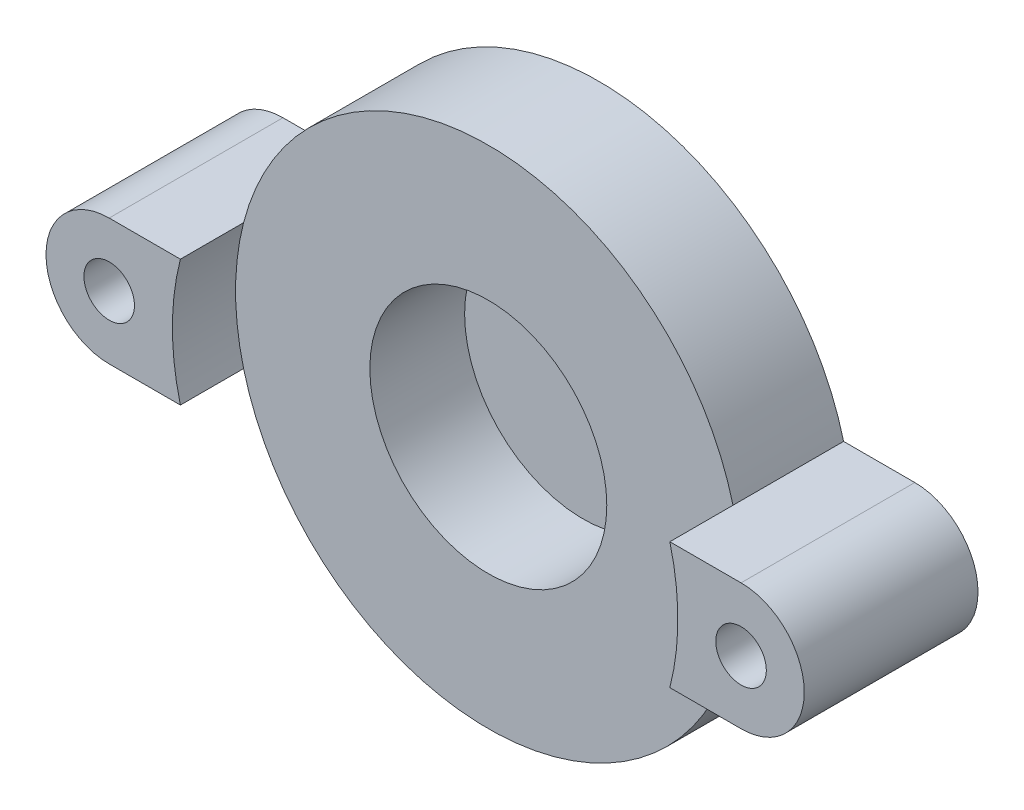
ISO-10303-21;
HEADER;
FILE_DESCRIPTION(('STEP AP214'),'2;1');
FILE_NAME('part.step','',(''),(''),'','','');
FILE_SCHEMA(('AUTOMOTIVE_DESIGN { 1 0 10303 214 1 1 1 1 }'));
ENDSEC;
DATA;
#1=APPLICATION_CONTEXT('core data for automotive mechanical design processes');
#2=APPLICATION_PROTOCOL_DEFINITION('international standard','automotive_design',2000,#1);
#3=PRODUCT_CONTEXT('',#1,'mechanical');
#4=PRODUCT('Part','Part','',(#3));
#5=PRODUCT_RELATED_PRODUCT_CATEGORY('part','',(#4));
#6=PRODUCT_DEFINITION_FORMATION('','',#4);
#7=PRODUCT_DEFINITION_CONTEXT('part definition',#1,'design');
#8=PRODUCT_DEFINITION('design','',#6,#7);
#9=PRODUCT_DEFINITION_SHAPE('','',#8);
#10=(LENGTH_UNIT() NAMED_UNIT(*) SI_UNIT(.MILLI.,.METRE.));
#11=(NAMED_UNIT(*) PLANE_ANGLE_UNIT() SI_UNIT($,.RADIAN.));
#12=(NAMED_UNIT(*) SI_UNIT($,.STERADIAN.) SOLID_ANGLE_UNIT());
#13=UNCERTAINTY_MEASURE_WITH_UNIT(LENGTH_MEASURE(1.E-05),#10,'distance_accuracy_value','');
#14=(GEOMETRIC_REPRESENTATION_CONTEXT(3) GLOBAL_UNCERTAINTY_ASSIGNED_CONTEXT((#13)) GLOBAL_UNIT_ASSIGNED_CONTEXT((#10,
#11,#12)) REPRESENTATION_CONTEXT('',''));
#15=CARTESIAN_POINT('',(0.,0.,0.));
#16=DIRECTION('',(0.,0.,1.));
#17=DIRECTION('',(1.,0.,0.));
#18=AXIS2_PLACEMENT_3D('',#15,#16,#17);
#19=CARTESIAN_POINT('',(0.,0.,2.));
#20=DIRECTION('',(0.,0.,-1.));
#21=DIRECTION('',(-1.,0.,0.));
#22=AXIS2_PLACEMENT_3D('',#19,#20,#21);
#23=CYLINDRICAL_SURFACE('',#22,16.);
#24=CARTESIAN_POINT('',(0.,0.,-5.));
#25=DIRECTION('',(0.,0.,-1.));
#26=DIRECTION('',(-1.,0.,0.));
#27=AXIS2_PLACEMENT_3D('',#24,#25,#26);
#28=CIRCLE('',#27,16.);
#29=CARTESIAN_POINT('',(-15.4919333848297,4.,-5.));
#30=VERTEX_POINT('',#29);
#31=CARTESIAN_POINT('',(15.4919333848297,4.,-5.));
#32=VERTEX_POINT('',#31);
#33=EDGE_CURVE('E157',#30,#32,#28,.T.);
#34=ORIENTED_EDGE('',*,*,#33,.F.);
#35=DIRECTION('',(0.,0.,-1.));
#36=VECTOR('',#35,1.);
#37=CARTESIAN_POINT('',(-15.4919333848297,4.,6.));
#38=LINE('',#37,#36);
#39=CARTESIAN_POINT('',(-15.4919333848297,4.,2.));
#40=VERTEX_POINT('',#39);
#41=EDGE_CURVE('E53',#40,#30,#38,.T.);
#42=ORIENTED_EDGE('',*,*,#41,.F.);
#43=CARTESIAN_POINT('',(0.,0.,2.));
#44=DIRECTION('',(0.,0.,1.));
#45=DIRECTION('',(1.,0.,0.));
#46=AXIS2_PLACEMENT_3D('',#43,#44,#45);
#47=CIRCLE('',#46,16.);
#48=CARTESIAN_POINT('',(15.4919333848297,4.,2.));
#49=VERTEX_POINT('',#48);
#50=EDGE_CURVE('E46',#49,#40,#47,.T.);
#51=ORIENTED_EDGE('',*,*,#50,.F.);
#52=DIRECTION('',(0.,0.,-1.));
#53=VECTOR('',#52,1.);
#54=CARTESIAN_POINT('',(15.4919333848297,4.,6.));
#55=LINE('',#54,#53);
#56=EDGE_CURVE('E177',#49,#32,#55,.T.);
#57=ORIENTED_EDGE('',*,*,#56,.T.);
#58=EDGE_LOOP('',(#34,#42,#51,#57));
#59=FACE_BOUND('',#58,.T.);
#60=ADVANCED_FACE('F37',(#59),#23,.T.);
#61=CARTESIAN_POINT('',(0.,0.,2.));
#62=DIRECTION('',(0.,0.,-1.));
#63=DIRECTION('',(-1.,0.,0.));
#64=AXIS2_PLACEMENT_3D('',#61,#62,#63);
#65=CYLINDRICAL_SURFACE('',#64,7.5);
#66=CARTESIAN_POINT('',(0.,0.,2.));
#67=DIRECTION('',(0.,0.,1.));
#68=DIRECTION('',(1.,0.,0.));
#69=AXIS2_PLACEMENT_3D('',#66,#67,#68);
#70=CIRCLE('',#69,7.5);
#71=CARTESIAN_POINT('',(7.5,0.,2.));
#72=VERTEX_POINT('',#71);
#73=EDGE_CURVE('E127',#72,#72,#70,.T.);
#74=ORIENTED_EDGE('',*,*,#73,.T.);
#75=EDGE_LOOP('',(#74));
#76=FACE_BOUND('',#75,.T.);
#77=CARTESIAN_POINT('',(0.,0.,-4.));
#78=DIRECTION('',(0.,0.,-1.));
#79=DIRECTION('',(-1.,0.,0.));
#80=AXIS2_PLACEMENT_3D('',#77,#78,#79);
#81=CIRCLE('',#80,7.5);
#82=CARTESIAN_POINT('',(-7.5,0.,-4.));
#83=VERTEX_POINT('',#82);
#84=EDGE_CURVE('E160',#83,#83,#81,.T.);
#85=ORIENTED_EDGE('',*,*,#84,.T.);
#86=EDGE_LOOP('',(#85));
#87=FACE_BOUND('',#86,.T.);
#88=ADVANCED_FACE('F39',(#76,#87),#65,.F.);
#89=DIRECTION('',(0.,0.,-1.));
#90=VECTOR('',#89,1.);
#91=CARTESIAN_POINT('',(-15.4919333848297,-4.,6.));
#92=LINE('',#91,#90);
#93=CARTESIAN_POINT('',(-15.4919333848297,-4.,2.));
#94=VERTEX_POINT('',#93);
#95=CARTESIAN_POINT('',(-15.4919333848297,-4.,-5.));
#96=VERTEX_POINT('',#95);
#97=EDGE_CURVE('E203',#94,#96,#92,.T.);
#98=ORIENTED_EDGE('',*,*,#97,.T.);
#99=CARTESIAN_POINT('',(15.4919333848297,-4.,-5.));
#100=VERTEX_POINT('',#99);
#101=EDGE_CURVE('E158',#100,#96,#28,.T.);
#102=ORIENTED_EDGE('',*,*,#101,.F.);
#103=DIRECTION('',(0.,0.,-1.));
#104=VECTOR('',#103,1.);
#105=CARTESIAN_POINT('',(15.4919333848297,-4.,6.));
#106=LINE('',#105,#104);
#107=CARTESIAN_POINT('',(15.4919333848297,-4.,2.));
#108=VERTEX_POINT('',#107);
#109=EDGE_CURVE('E61',#108,#100,#106,.T.);
#110=ORIENTED_EDGE('',*,*,#109,.F.);
#111=EDGE_CURVE('E45',#94,#108,#47,.T.);
#112=ORIENTED_EDGE('',*,*,#111,.F.);
#113=EDGE_LOOP('',(#98,#102,#110,#112));
#114=FACE_BOUND('',#113,.T.);
#115=ADVANCED_FACE('F246',(#114),#23,.T.);
#116=CARTESIAN_POINT('',(0.,0.,2.));
#117=DIRECTION('',(0.,0.,1.));
#118=DIRECTION('',(1.,0.,0.));
#119=AXIS2_PLACEMENT_3D('',#116,#117,#118);
#120=PLANE('',#119);
#121=ORIENTED_EDGE('',*,*,#73,.F.);
#122=EDGE_LOOP('',(#121));
#123=FACE_BOUND('',#122,.T.);
#124=EDGE_CURVE('E11',#40,#94,#47,.T.);
#125=ORIENTED_EDGE('',*,*,#124,.T.);
#126=ORIENTED_EDGE('',*,*,#111,.T.);
#127=CARTESIAN_POINT('',(0.,0.,2.));
#128=DIRECTION('',(0.,0.,1.));
#129=DIRECTION('',(1.,0.,0.));
#130=AXIS2_PLACEMENT_3D('',#127,#128,#129);
#131=CIRCLE('',#130,16.);
#132=EDGE_CURVE('E187',#49,#108,#131,.F.);
#133=ORIENTED_EDGE('',*,*,#132,.F.);
#134=ORIENTED_EDGE('',*,*,#50,.T.);
#135=EDGE_LOOP('',(#125,#126,#133,#134));
#136=FACE_BOUND('',#135,.T.);
#137=ADVANCED_FACE('F213',(#123,#136),#120,.T.);
#138=CARTESIAN_POINT('',(0.,4.,6.));
#139=DIRECTION('',(0.,1.,0.));
#140=DIRECTION('',(0.,0.,1.));
#141=AXIS2_PLACEMENT_3D('',#138,#139,#140);
#142=PLANE('',#141);
#143=ORIENTED_EDGE('',*,*,#41,.T.);
#144=DIRECTION('',(1.,0.,0.));
#145=VECTOR('',#144,1.);
#146=CARTESIAN_POINT('',(0.,4.,-5.));
#147=LINE('',#146,#145);
#148=CARTESIAN_POINT('',(-20.,4.,-5.));
#149=VERTEX_POINT('',#148);
#150=EDGE_CURVE('E130',#149,#30,#147,.T.);
#151=ORIENTED_EDGE('',*,*,#150,.F.);
#152=DIRECTION('',(0.,0.,-1.));
#153=VECTOR('',#152,1.);
#154=CARTESIAN_POINT('',(-20.,4.,6.));
#155=LINE('',#154,#153);
#156=CARTESIAN_POINT('',(-20.,4.,6.));
#157=VERTEX_POINT('',#156);
#158=EDGE_CURVE('E118',#157,#149,#155,.T.);
#159=ORIENTED_EDGE('',*,*,#158,.F.);
#160=DIRECTION('',(1.,0.,0.));
#161=VECTOR('',#160,1.);
#162=CARTESIAN_POINT('',(0.,4.,6.));
#163=LINE('',#162,#161);
#164=CARTESIAN_POINT('',(-15.4919333848297,4.,6.));
#165=VERTEX_POINT('',#164);
#166=EDGE_CURVE('E193',#157,#165,#163,.T.);
#167=ORIENTED_EDGE('',*,*,#166,.T.);
#168=EDGE_CURVE('E201',#165,#40,#38,.T.);
#169=ORIENTED_EDGE('',*,*,#168,.T.);
#170=EDGE_LOOP('',(#143,#151,#159,#167,#169));
#171=FACE_BOUND('',#170,.T.);
#172=ADVANCED_FACE('F131',(#171),#142,.T.);
#173=CARTESIAN_POINT('',(-20.,0.,6.));
#174=DIRECTION('',(0.,0.,-1.));
#175=DIRECTION('',(-1.,0.,0.));
#176=AXIS2_PLACEMENT_3D('',#173,#174,#175);
#177=CYLINDRICAL_SURFACE('',#176,4.);
#178=ORIENTED_EDGE('',*,*,#158,.T.);
#179=CARTESIAN_POINT('',(-20.,0.,-5.));
#180=DIRECTION('',(0.,0.,1.));
#181=DIRECTION('',(1.,0.,0.));
#182=AXIS2_PLACEMENT_3D('',#179,#180,#181);
#183=CIRCLE('',#182,4.);
#184=CARTESIAN_POINT('',(-20.,-4.,-5.));
#185=VERTEX_POINT('',#184);
#186=EDGE_CURVE('E122',#149,#185,#183,.T.);
#187=ORIENTED_EDGE('',*,*,#186,.T.);
#188=DIRECTION('',(0.,0.,-1.));
#189=VECTOR('',#188,1.);
#190=CARTESIAN_POINT('',(-20.,-4.,6.));
#191=LINE('',#190,#189);
#192=CARTESIAN_POINT('',(-20.,-4.,6.));
#193=VERTEX_POINT('',#192);
#194=EDGE_CURVE('E128',#193,#185,#191,.T.);
#195=ORIENTED_EDGE('',*,*,#194,.F.);
#196=CARTESIAN_POINT('',(-20.,0.,6.));
#197=DIRECTION('',(0.,0.,1.));
#198=DIRECTION('',(1.,0.,0.));
#199=AXIS2_PLACEMENT_3D('',#196,#197,#198);
#200=CIRCLE('',#199,4.);
#201=EDGE_CURVE('E124',#157,#193,#200,.T.);
#202=ORIENTED_EDGE('',*,*,#201,.F.);
#203=EDGE_LOOP('',(#178,#187,#195,#202));
#204=FACE_BOUND('',#203,.T.);
#205=ADVANCED_FACE('F119',(#204),#177,.T.);
#206=CARTESIAN_POINT('',(0.,-4.,6.));
#207=DIRECTION('',(0.,1.,0.));
#208=DIRECTION('',(0.,0.,1.));
#209=AXIS2_PLACEMENT_3D('',#206,#207,#208);
#210=PLANE('',#209);
#211=ORIENTED_EDGE('',*,*,#194,.T.);
#212=DIRECTION('',(1.,0.,0.));
#213=VECTOR('',#212,1.);
#214=CARTESIAN_POINT('',(0.,-4.,-5.));
#215=LINE('',#214,#213);
#216=EDGE_CURVE('E141',#185,#96,#215,.T.);
#217=ORIENTED_EDGE('',*,*,#216,.T.);
#218=ORIENTED_EDGE('',*,*,#97,.F.);
#219=CARTESIAN_POINT('',(-15.4919333848297,-4.,6.));
#220=VERTEX_POINT('',#219);
#221=EDGE_CURVE('E204',#220,#94,#92,.T.);
#222=ORIENTED_EDGE('',*,*,#221,.F.);
#223=DIRECTION('',(1.,0.,0.));
#224=VECTOR('',#223,1.);
#225=CARTESIAN_POINT('',(0.,-4.,6.));
#226=LINE('',#225,#224);
#227=EDGE_CURVE('E196',#193,#220,#226,.T.);
#228=ORIENTED_EDGE('',*,*,#227,.F.);
#229=EDGE_LOOP('',(#211,#217,#218,#222,#228));
#230=FACE_BOUND('',#229,.T.);
#231=ADVANCED_FACE('F244',(#230),#210,.F.);
#232=CARTESIAN_POINT('',(-20.,0.,6.));
#233=DIRECTION('',(0.,0.,-1.));
#234=DIRECTION('',(-1.,0.,0.));
#235=AXIS2_PLACEMENT_3D('',#232,#233,#234);
#236=CYLINDRICAL_SURFACE('',#235,1.6);
#237=CARTESIAN_POINT('',(-20.,0.,6.));
#238=DIRECTION('',(0.,0.,1.));
#239=DIRECTION('',(1.,0.,0.));
#240=AXIS2_PLACEMENT_3D('',#237,#238,#239);
#241=CIRCLE('',#240,1.6);
#242=CARTESIAN_POINT('',(-18.4,0.,6.));
#243=VERTEX_POINT('',#242);
#244=EDGE_CURVE('E190',#243,#243,#241,.T.);
#245=ORIENTED_EDGE('',*,*,#244,.T.);
#246=EDGE_LOOP('',(#245));
#247=FACE_BOUND('',#246,.T.);
#248=CARTESIAN_POINT('',(-20.,0.,-5.));
#249=DIRECTION('',(0.,0.,1.));
#250=DIRECTION('',(1.,0.,0.));
#251=AXIS2_PLACEMENT_3D('',#248,#249,#250);
#252=CIRCLE('',#251,1.6);
#253=CARTESIAN_POINT('',(-18.4,0.,-5.));
#254=VERTEX_POINT('',#253);
#255=EDGE_CURVE('E134',#254,#254,#252,.T.);
#256=ORIENTED_EDGE('',*,*,#255,.F.);
#257=EDGE_LOOP('',(#256));
#258=FACE_BOUND('',#257,.T.);
#259=ADVANCED_FACE('F335',(#247,#258),#236,.F.);
#260=CARTESIAN_POINT('',(0.,0.,6.));
#261=DIRECTION('',(0.,0.,-1.));
#262=DIRECTION('',(-1.,0.,0.));
#263=AXIS2_PLACEMENT_3D('',#260,#261,#262);
#264=CYLINDRICAL_SURFACE('',#263,16.);
#265=ORIENTED_EDGE('',*,*,#221,.T.);
#266=ORIENTED_EDGE('',*,*,#124,.F.);
#267=ORIENTED_EDGE('',*,*,#168,.F.);
#268=CARTESIAN_POINT('',(0.,0.,6.));
#269=DIRECTION('',(0.,0.,1.));
#270=DIRECTION('',(1.,0.,0.));
#271=AXIS2_PLACEMENT_3D('',#268,#269,#270);
#272=CIRCLE('',#271,16.);
#273=EDGE_CURVE('E198',#165,#220,#272,.T.);
#274=ORIENTED_EDGE('',*,*,#273,.T.);
#275=EDGE_LOOP('',(#265,#266,#267,#274));
#276=FACE_BOUND('',#275,.T.);
#277=ADVANCED_FACE('F238',(#276),#264,.F.);
#278=CARTESIAN_POINT('',(0.,0.,6.));
#279=DIRECTION('',(0.,0.,1.));
#280=DIRECTION('',(1.,0.,0.));
#281=AXIS2_PLACEMENT_3D('',#278,#279,#280);
#282=PLANE('',#281);
#283=ORIENTED_EDGE('',*,*,#244,.F.);
#284=EDGE_LOOP('',(#283));
#285=FACE_BOUND('',#284,.T.);
#286=ORIENTED_EDGE('',*,*,#166,.F.);
#287=ORIENTED_EDGE('',*,*,#201,.T.);
#288=ORIENTED_EDGE('',*,*,#227,.T.);
#289=ORIENTED_EDGE('',*,*,#273,.F.);
#290=EDGE_LOOP('',(#286,#287,#288,#289));
#291=FACE_BOUND('',#290,.T.);
#292=ADVANCED_FACE('F242',(#285,#291),#282,.T.);
#293=CARTESIAN_POINT('',(0.,0.,6.));
#294=DIRECTION('',(0.,0.,-1.));
#295=DIRECTION('',(-1.,0.,0.));
#296=AXIS2_PLACEMENT_3D('',#293,#294,#295);
#297=CYLINDRICAL_SURFACE('',#296,16.);
#298=CARTESIAN_POINT('',(15.4919333848297,4.,6.));
#299=VERTEX_POINT('',#298);
#300=EDGE_CURVE('E178',#299,#49,#55,.T.);
#301=ORIENTED_EDGE('',*,*,#300,.T.);
#302=ORIENTED_EDGE('',*,*,#132,.T.);
#303=CARTESIAN_POINT('',(15.4919333848297,-4.,6.));
#304=VERTEX_POINT('',#303);
#305=EDGE_CURVE('E185',#304,#108,#106,.T.);
#306=ORIENTED_EDGE('',*,*,#305,.F.);
#307=CARTESIAN_POINT('',(0.,0.,6.));
#308=DIRECTION('',(0.,0.,1.));
#309=DIRECTION('',(1.,0.,0.));
#310=AXIS2_PLACEMENT_3D('',#307,#308,#309);
#311=CIRCLE('',#310,16.);
#312=EDGE_CURVE('E163',#304,#299,#311,.T.);
#313=ORIENTED_EDGE('',*,*,#312,.T.);
#314=EDGE_LOOP('',(#301,#302,#306,#313));
#315=FACE_BOUND('',#314,.T.);
#316=ADVANCED_FACE('F219',(#315),#297,.F.);
#317=CARTESIAN_POINT('',(0.,-4.,6.));
#318=DIRECTION('',(0.,-1.,0.));
#319=DIRECTION('',(0.,0.,-1.));
#320=AXIS2_PLACEMENT_3D('',#317,#318,#319);
#321=PLANE('',#320);
#322=ORIENTED_EDGE('',*,*,#109,.T.);
#323=DIRECTION('',(-1.,0.,0.));
#324=VECTOR('',#323,1.);
#325=CARTESIAN_POINT('',(0.,-4.,-5.));
#326=LINE('',#325,#324);
#327=CARTESIAN_POINT('',(20.,-4.,-5.));
#328=VERTEX_POINT('',#327);
#329=EDGE_CURVE('E143',#328,#100,#326,.T.);
#330=ORIENTED_EDGE('',*,*,#329,.F.);
#331=DIRECTION('',(0.,0.,-1.));
#332=VECTOR('',#331,1.);
#333=CARTESIAN_POINT('',(20.,-4.,6.));
#334=LINE('',#333,#332);
#335=CARTESIAN_POINT('',(20.,-4.,6.));
#336=VERTEX_POINT('',#335);
#337=EDGE_CURVE('E183',#336,#328,#334,.T.);
#338=ORIENTED_EDGE('',*,*,#337,.F.);
#339=DIRECTION('',(-1.,0.,0.));
#340=VECTOR('',#339,1.);
#341=CARTESIAN_POINT('',(0.,-4.,6.));
#342=LINE('',#341,#340);
#343=EDGE_CURVE('E166',#336,#304,#342,.T.);
#344=ORIENTED_EDGE('',*,*,#343,.T.);
#345=ORIENTED_EDGE('',*,*,#305,.T.);
#346=EDGE_LOOP('',(#322,#330,#338,#344,#345));
#347=FACE_BOUND('',#346,.T.);
#348=ADVANCED_FACE('F222',(#347),#321,.T.);
#349=CARTESIAN_POINT('',(20.,0.,6.));
#350=DIRECTION('',(0.,0.,-1.));
#351=DIRECTION('',(-1.,0.,0.));
#352=AXIS2_PLACEMENT_3D('',#349,#350,#351);
#353=CYLINDRICAL_SURFACE('',#352,4.);
#354=ORIENTED_EDGE('',*,*,#337,.T.);
#355=CARTESIAN_POINT('',(20.,0.,-5.));
#356=DIRECTION('',(0.,0.,1.));
#357=DIRECTION('',(1.,0.,0.));
#358=AXIS2_PLACEMENT_3D('',#355,#356,#357);
#359=CIRCLE('',#358,4.);
#360=CARTESIAN_POINT('',(20.,4.,-5.));
#361=VERTEX_POINT('',#360);
#362=EDGE_CURVE('E148',#361,#328,#359,.F.);
#363=ORIENTED_EDGE('',*,*,#362,.F.);
#364=DIRECTION('',(0.,0.,-1.));
#365=VECTOR('',#364,1.);
#366=CARTESIAN_POINT('',(20.,4.,6.));
#367=LINE('',#366,#365);
#368=CARTESIAN_POINT('',(20.,4.,6.));
#369=VERTEX_POINT('',#368);
#370=EDGE_CURVE('E181',#369,#361,#367,.T.);
#371=ORIENTED_EDGE('',*,*,#370,.F.);
#372=CARTESIAN_POINT('',(20.,0.,6.));
#373=DIRECTION('',(0.,0.,1.));
#374=DIRECTION('',(1.,0.,0.));
#375=AXIS2_PLACEMENT_3D('',#372,#373,#374);
#376=CIRCLE('',#375,4.);
#377=EDGE_CURVE('E169',#369,#336,#376,.F.);
#378=ORIENTED_EDGE('',*,*,#377,.T.);
#379=EDGE_LOOP('',(#354,#363,#371,#378));
#380=FACE_BOUND('',#379,.T.);
#381=ADVANCED_FACE('F229',(#380),#353,.T.);
#382=CARTESIAN_POINT('',(0.,4.,6.));
#383=DIRECTION('',(0.,-1.,0.));
#384=DIRECTION('',(0.,0.,-1.));
#385=AXIS2_PLACEMENT_3D('',#382,#383,#384);
#386=PLANE('',#385);
#387=ORIENTED_EDGE('',*,*,#370,.T.);
#388=DIRECTION('',(-1.,0.,0.));
#389=VECTOR('',#388,1.);
#390=CARTESIAN_POINT('',(0.,4.,-5.));
#391=LINE('',#390,#389);
#392=EDGE_CURVE('E151',#361,#32,#391,.T.);
#393=ORIENTED_EDGE('',*,*,#392,.T.);
#394=ORIENTED_EDGE('',*,*,#56,.F.);
#395=ORIENTED_EDGE('',*,*,#300,.F.);
#396=DIRECTION('',(-1.,0.,0.));
#397=VECTOR('',#396,1.);
#398=CARTESIAN_POINT('',(0.,4.,6.));
#399=LINE('',#398,#397);
#400=EDGE_CURVE('E172',#369,#299,#399,.T.);
#401=ORIENTED_EDGE('',*,*,#400,.F.);
#402=EDGE_LOOP('',(#387,#393,#394,#395,#401));
#403=FACE_BOUND('',#402,.T.);
#404=ADVANCED_FACE('F234',(#403),#386,.F.);
#405=CARTESIAN_POINT('',(20.,0.,6.));
#406=DIRECTION('',(0.,0.,-1.));
#407=DIRECTION('',(-1.,0.,0.));
#408=AXIS2_PLACEMENT_3D('',#405,#406,#407);
#409=CYLINDRICAL_SURFACE('',#408,1.6);
#410=CARTESIAN_POINT('',(20.,0.,6.));
#411=DIRECTION('',(0.,0.,1.));
#412=DIRECTION('',(1.,0.,0.));
#413=AXIS2_PLACEMENT_3D('',#410,#411,#412);
#414=CIRCLE('',#413,1.6);
#415=CARTESIAN_POINT('',(21.6,0.,6.));
#416=VERTEX_POINT('',#415);
#417=EDGE_CURVE('E174',#416,#416,#414,.F.);
#418=ORIENTED_EDGE('',*,*,#417,.F.);
#419=EDGE_LOOP('',(#418));
#420=FACE_BOUND('',#419,.T.);
#421=CARTESIAN_POINT('',(20.,0.,-5.));
#422=DIRECTION('',(0.,0.,1.));
#423=DIRECTION('',(1.,0.,0.));
#424=AXIS2_PLACEMENT_3D('',#421,#422,#423);
#425=CIRCLE('',#424,1.6);
#426=CARTESIAN_POINT('',(21.6,0.,-5.));
#427=VERTEX_POINT('',#426);
#428=EDGE_CURVE('E154',#427,#427,#425,.F.);
#429=ORIENTED_EDGE('',*,*,#428,.T.);
#430=EDGE_LOOP('',(#429));
#431=FACE_BOUND('',#430,.T.);
#432=ADVANCED_FACE('F293',(#420,#431),#409,.F.);
#433=CARTESIAN_POINT('',(0.,0.,6.));
#434=DIRECTION('',(0.,0.,1.));
#435=DIRECTION('',(1.,0.,0.));
#436=AXIS2_PLACEMENT_3D('',#433,#434,#435);
#437=PLANE('',#436);
#438=ORIENTED_EDGE('',*,*,#312,.F.);
#439=ORIENTED_EDGE('',*,*,#343,.F.);
#440=ORIENTED_EDGE('',*,*,#377,.F.);
#441=ORIENTED_EDGE('',*,*,#400,.T.);
#442=EDGE_LOOP('',(#438,#439,#440,#441));
#443=FACE_BOUND('',#442,.T.);
#444=ORIENTED_EDGE('',*,*,#417,.T.);
#445=EDGE_LOOP('',(#444));
#446=FACE_BOUND('',#445,.T.);
#447=ADVANCED_FACE('F226',(#443,#446),#437,.T.);
#448=CARTESIAN_POINT('',(0.,0.,-5.));
#449=DIRECTION('',(0.,0.,-1.));
#450=DIRECTION('',(-1.,0.,0.));
#451=AXIS2_PLACEMENT_3D('',#448,#449,#450);
#452=PLANE('',#451);
#453=ORIENTED_EDGE('',*,*,#101,.T.);
#454=ORIENTED_EDGE('',*,*,#216,.F.);
#455=ORIENTED_EDGE('',*,*,#186,.F.);
#456=ORIENTED_EDGE('',*,*,#150,.T.);
#457=ORIENTED_EDGE('',*,*,#33,.T.);
#458=ORIENTED_EDGE('',*,*,#392,.F.);
#459=ORIENTED_EDGE('',*,*,#362,.T.);
#460=ORIENTED_EDGE('',*,*,#329,.T.);
#461=EDGE_LOOP('',(#453,#454,#455,#456,#457,#458,#459,#460));
#462=FACE_BOUND('',#461,.T.);
#463=ORIENTED_EDGE('',*,*,#428,.F.);
#464=EDGE_LOOP('',(#463));
#465=FACE_BOUND('',#464,.T.);
#466=ORIENTED_EDGE('',*,*,#255,.T.);
#467=EDGE_LOOP('',(#466));
#468=FACE_BOUND('',#467,.T.);
#469=ADVANCED_FACE('F138',(#462,#465,#468),#452,.T.);
#470=CARTESIAN_POINT('',(0.,0.,-4.));
#471=DIRECTION('',(0.,0.,-1.));
#472=DIRECTION('',(-1.,0.,0.));
#473=AXIS2_PLACEMENT_3D('',#470,#471,#472);
#474=PLANE('',#473);
#475=ORIENTED_EDGE('',*,*,#84,.F.);
#476=EDGE_LOOP('',(#475));
#477=FACE_BOUND('',#476,.T.);
#478=ADVANCED_FACE('F273',(#477),#474,.F.);
#479=CLOSED_SHELL('',(#60,#88,#115,#137,#172,#205,#231,#259,#277,#292,#316,#348,#381,#404,#432,
#447,#469,#478));
#480=MANIFOLD_SOLID_BREP('B2',#479);
#481=ADVANCED_BREP_SHAPE_REPRESENTATION('',(#18,#480),#14);
#482=SHAPE_DEFINITION_REPRESENTATION(#9,#481);
ENDSEC;
END-ISO-10303-21;
